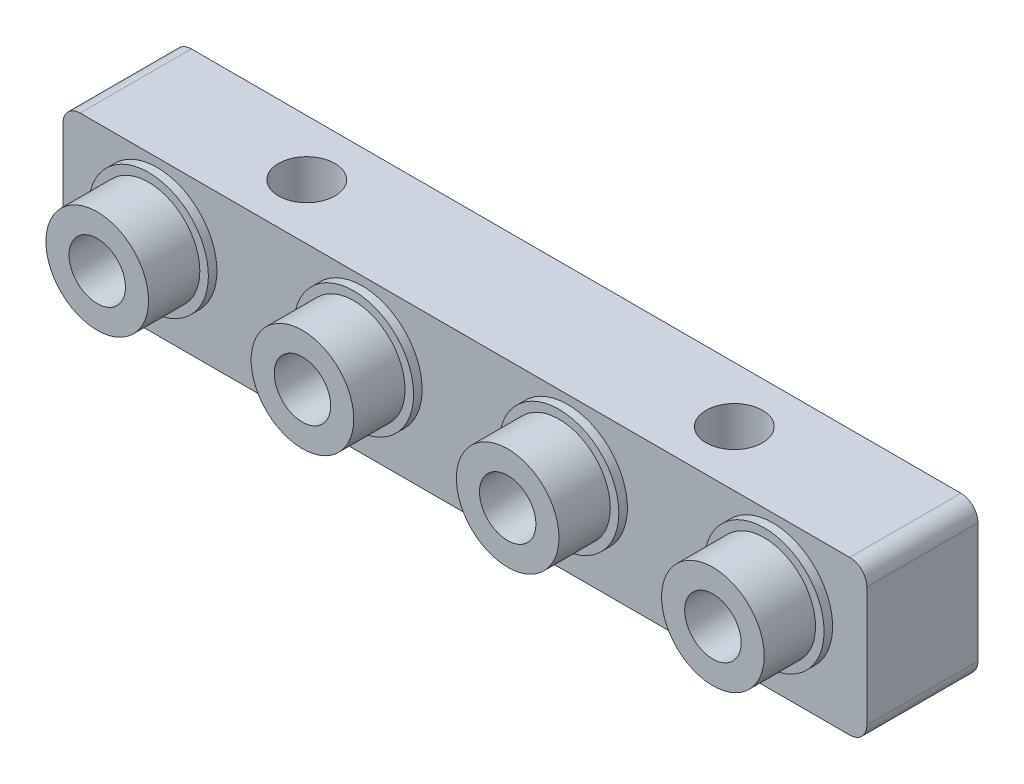
ISO-10303-21;
HEADER;
FILE_DESCRIPTION(('STEP AP214'),'2;1');
FILE_NAME('part.step','',(''),(''),'','','');
FILE_SCHEMA(('AUTOMOTIVE_DESIGN { 1 0 10303 214 1 1 1 1 }'));
ENDSEC;
DATA;
#1=APPLICATION_CONTEXT('core data for automotive mechanical design processes');
#2=APPLICATION_PROTOCOL_DEFINITION('international standard','automotive_design',2000,#1);
#3=PRODUCT_CONTEXT('',#1,'mechanical');
#4=PRODUCT('Part','Part','',(#3));
#5=PRODUCT_RELATED_PRODUCT_CATEGORY('part','',(#4));
#6=PRODUCT_DEFINITION_FORMATION('','',#4);
#7=PRODUCT_DEFINITION_CONTEXT('part definition',#1,'design');
#8=PRODUCT_DEFINITION('design','',#6,#7);
#9=PRODUCT_DEFINITION_SHAPE('','',#8);
#10=(LENGTH_UNIT() NAMED_UNIT(*) SI_UNIT(.MILLI.,.METRE.));
#11=(NAMED_UNIT(*) PLANE_ANGLE_UNIT() SI_UNIT($,.RADIAN.));
#12=(NAMED_UNIT(*) SI_UNIT($,.STERADIAN.) SOLID_ANGLE_UNIT());
#13=UNCERTAINTY_MEASURE_WITH_UNIT(LENGTH_MEASURE(1.E-05),#10,'distance_accuracy_value','');
#14=(GEOMETRIC_REPRESENTATION_CONTEXT(3) GLOBAL_UNCERTAINTY_ASSIGNED_CONTEXT((#13)) GLOBAL_UNIT_ASSIGNED_CONTEXT((#10,
#11,#12)) REPRESENTATION_CONTEXT('',''));
#15=CARTESIAN_POINT('',(0.,0.,0.));
#16=DIRECTION('',(0.,0.,1.));
#17=DIRECTION('',(1.,0.,0.));
#18=AXIS2_PLACEMENT_3D('',#15,#16,#17);
#19=CARTESIAN_POINT('',(0.,0.,6.5));
#20=DIRECTION('',(1.,0.,0.));
#21=DIRECTION('',(0.,0.,-1.));
#22=AXIS2_PLACEMENT_3D('',#19,#20,#21);
#23=PLANE('',#22);
#24=DIRECTION('',(0.,-1.,0.));
#25=VECTOR('',#24,1.);
#26=CARTESIAN_POINT('',(0.,0.,0.));
#27=LINE('',#26,#25);
#28=CARTESIAN_POINT('',(0.,8.,0.));
#29=VERTEX_POINT('',#28);
#30=CARTESIAN_POINT('',(0.,1.,0.));
#31=VERTEX_POINT('',#30);
#32=EDGE_CURVE('E131',#29,#31,#27,.T.);
#33=ORIENTED_EDGE('',*,*,#32,.T.);
#34=DIRECTION('',(0.,0.,-1.));
#35=VECTOR('',#34,1.);
#36=CARTESIAN_POINT('',(0.,1.,6.5));
#37=LINE('',#36,#35);
#38=CARTESIAN_POINT('',(0.,1.,6.5));
#39=VERTEX_POINT('',#38);
#40=EDGE_CURVE('E11',#31,#39,#37,.F.);
#41=ORIENTED_EDGE('',*,*,#40,.T.);
#42=DIRECTION('',(0.,-1.,0.));
#43=VECTOR('',#42,1.);
#44=CARTESIAN_POINT('',(0.,0.,6.5));
#45=LINE('',#44,#43);
#46=CARTESIAN_POINT('',(0.,8.,6.5));
#47=VERTEX_POINT('',#46);
#48=EDGE_CURVE('E129',#47,#39,#45,.T.);
#49=ORIENTED_EDGE('',*,*,#48,.F.);
#50=DIRECTION('',(0.,0.,-1.));
#51=VECTOR('',#50,1.);
#52=CARTESIAN_POINT('',(0.,8.,6.5));
#53=LINE('',#52,#51);
#54=EDGE_CURVE('E43',#47,#29,#53,.T.);
#55=ORIENTED_EDGE('',*,*,#54,.T.);
#56=EDGE_LOOP('',(#33,#41,#49,#55));
#57=FACE_BOUND('',#56,.T.);
#58=ADVANCED_FACE('F35',(#57),#23,.F.);
#59=CARTESIAN_POINT('',(0.,0.,6.5));
#60=DIRECTION('',(0.,1.,0.));
#61=DIRECTION('',(0.,0.,1.));
#62=AXIS2_PLACEMENT_3D('',#59,#60,#61);
#63=PLANE('',#62);
#64=CARTESIAN_POINT('',(11.,0.,3.25));
#65=DIRECTION('',(0.,1.,0.));
#66=DIRECTION('',(0.,0.,1.));
#67=AXIS2_PLACEMENT_3D('',#64,#65,#66);
#68=CIRCLE('',#67,1.65);
#69=CARTESIAN_POINT('',(11.,0.,4.9));
#70=VERTEX_POINT('',#69);
#71=EDGE_CURVE('E227',#70,#70,#68,.F.);
#72=ORIENTED_EDGE('',*,*,#71,.F.);
#73=EDGE_LOOP('',(#72));
#74=FACE_BOUND('',#73,.T.);
#75=CARTESIAN_POINT('',(36.,0.,3.25));
#76=DIRECTION('',(0.,1.,0.));
#77=DIRECTION('',(0.,0.,1.));
#78=AXIS2_PLACEMENT_3D('',#75,#76,#77);
#79=CIRCLE('',#78,1.65);
#80=CARTESIAN_POINT('',(36.,0.,4.9));
#81=VERTEX_POINT('',#80);
#82=EDGE_CURVE('E244',#81,#81,#79,.F.);
#83=ORIENTED_EDGE('',*,*,#82,.F.);
#84=EDGE_LOOP('',(#83));
#85=FACE_BOUND('',#84,.T.);
#86=DIRECTION('',(1.,0.,0.));
#87=VECTOR('',#86,1.);
#88=CARTESIAN_POINT('',(0.,0.,0.));
#89=LINE('',#88,#87);
#90=CARTESIAN_POINT('',(1.,0.,0.));
#91=VERTEX_POINT('',#90);
#92=CARTESIAN_POINT('',(46.,0.,0.));
#93=VERTEX_POINT('',#92);
#94=EDGE_CURVE('E127',#91,#93,#89,.T.);
#95=ORIENTED_EDGE('',*,*,#94,.T.);
#96=DIRECTION('',(0.,0.,-1.));
#97=VECTOR('',#96,1.);
#98=CARTESIAN_POINT('',(46.,0.,6.5));
#99=LINE('',#98,#97);
#100=CARTESIAN_POINT('',(46.,0.,6.5));
#101=VERTEX_POINT('',#100);
#102=EDGE_CURVE('E106',#93,#101,#99,.F.);
#103=ORIENTED_EDGE('',*,*,#102,.T.);
#104=DIRECTION('',(1.,0.,0.));
#105=VECTOR('',#104,1.);
#106=CARTESIAN_POINT('',(0.,0.,6.5));
#107=LINE('',#106,#105);
#108=CARTESIAN_POINT('',(1.,0.,6.5));
#109=VERTEX_POINT('',#108);
#110=EDGE_CURVE('E200',#109,#101,#107,.T.);
#111=ORIENTED_EDGE('',*,*,#110,.F.);
#112=DIRECTION('',(0.,0.,-1.));
#113=VECTOR('',#112,1.);
#114=CARTESIAN_POINT('',(1.,0.,6.5));
#115=LINE('',#114,#113);
#116=EDGE_CURVE('E111',#109,#91,#115,.T.);
#117=ORIENTED_EDGE('',*,*,#116,.T.);
#118=EDGE_LOOP('',(#95,#103,#111,#117));
#119=FACE_BOUND('',#118,.T.);
#120=ADVANCED_FACE('F271',(#74,#85,#119),#63,.F.);
#121=CARTESIAN_POINT('',(47.,0.,6.5));
#122=DIRECTION('',(-1.,0.,0.));
#123=DIRECTION('',(0.,0.,1.));
#124=AXIS2_PLACEMENT_3D('',#121,#122,#123);
#125=PLANE('',#124);
#126=DIRECTION('',(0.,1.,0.));
#127=VECTOR('',#126,1.);
#128=CARTESIAN_POINT('',(47.,0.,6.5));
#129=LINE('',#128,#127);
#130=CARTESIAN_POINT('',(47.,1.,6.5));
#131=VERTEX_POINT('',#130);
#132=CARTESIAN_POINT('',(47.,8.,6.5));
#133=VERTEX_POINT('',#132);
#134=EDGE_CURVE('E120',#131,#133,#129,.T.);
#135=ORIENTED_EDGE('',*,*,#134,.F.);
#136=DIRECTION('',(0.,0.,-1.));
#137=VECTOR('',#136,1.);
#138=CARTESIAN_POINT('',(47.,1.,6.5));
#139=LINE('',#138,#137);
#140=CARTESIAN_POINT('',(47.,1.,0.));
#141=VERTEX_POINT('',#140);
#142=EDGE_CURVE('E105',#131,#141,#139,.T.);
#143=ORIENTED_EDGE('',*,*,#142,.T.);
#144=DIRECTION('',(0.,1.,0.));
#145=VECTOR('',#144,1.);
#146=CARTESIAN_POINT('',(47.,0.,0.));
#147=LINE('',#146,#145);
#148=CARTESIAN_POINT('',(47.,8.,0.));
#149=VERTEX_POINT('',#148);
#150=EDGE_CURVE('E118',#141,#149,#147,.T.);
#151=ORIENTED_EDGE('',*,*,#150,.T.);
#152=DIRECTION('',(0.,0.,-1.));
#153=VECTOR('',#152,1.);
#154=CARTESIAN_POINT('',(47.,8.,6.5));
#155=LINE('',#154,#153);
#156=EDGE_CURVE('E122',#149,#133,#155,.F.);
#157=ORIENTED_EDGE('',*,*,#156,.T.);
#158=EDGE_LOOP('',(#135,#143,#151,#157));
#159=FACE_BOUND('',#158,.T.);
#160=ADVANCED_FACE('F117',(#159),#125,.F.);
#161=CARTESIAN_POINT('',(0.,9.,6.5));
#162=DIRECTION('',(0.,-1.,0.));
#163=DIRECTION('',(0.,0.,-1.));
#164=AXIS2_PLACEMENT_3D('',#161,#162,#163);
#165=PLANE('',#164);
#166=CARTESIAN_POINT('',(11.,9.,3.25));
#167=DIRECTION('',(0.,1.,0.));
#168=DIRECTION('',(0.,0.,1.));
#169=AXIS2_PLACEMENT_3D('',#166,#167,#168);
#170=CIRCLE('',#169,1.65);
#171=CARTESIAN_POINT('',(11.,9.,4.9));
#172=VERTEX_POINT('',#171);
#173=EDGE_CURVE('E247',#172,#172,#170,.T.);
#174=ORIENTED_EDGE('',*,*,#173,.F.);
#175=EDGE_LOOP('',(#174));
#176=FACE_BOUND('',#175,.T.);
#177=CARTESIAN_POINT('',(36.,9.,3.25));
#178=DIRECTION('',(0.,1.,0.));
#179=DIRECTION('',(0.,0.,-1.));
#180=AXIS2_PLACEMENT_3D('',#177,#178,#179);
#181=CIRCLE('',#180,1.65);
#182=CARTESIAN_POINT('',(36.,9.,1.59999999999999));
#183=VERTEX_POINT('',#182);
#184=EDGE_CURVE('E248',#183,#183,#181,.T.);
#185=ORIENTED_EDGE('',*,*,#184,.F.);
#186=EDGE_LOOP('',(#185));
#187=FACE_BOUND('',#186,.T.);
#188=DIRECTION('',(-1.,0.,0.));
#189=VECTOR('',#188,1.);
#190=CARTESIAN_POINT('',(0.,9.,6.5));
#191=LINE('',#190,#189);
#192=CARTESIAN_POINT('',(46.,9.,6.5));
#193=VERTEX_POINT('',#192);
#194=CARTESIAN_POINT('',(1.,9.,6.5));
#195=VERTEX_POINT('',#194);
#196=EDGE_CURVE('E144',#193,#195,#191,.T.);
#197=ORIENTED_EDGE('',*,*,#196,.F.);
#198=DIRECTION('',(0.,0.,-1.));
#199=VECTOR('',#198,1.);
#200=CARTESIAN_POINT('',(46.,9.,6.5));
#201=LINE('',#200,#199);
#202=CARTESIAN_POINT('',(46.,9.,0.));
#203=VERTEX_POINT('',#202);
#204=EDGE_CURVE('E181',#193,#203,#201,.T.);
#205=ORIENTED_EDGE('',*,*,#204,.T.);
#206=DIRECTION('',(-1.,0.,0.));
#207=VECTOR('',#206,1.);
#208=CARTESIAN_POINT('',(0.,9.,0.));
#209=LINE('',#208,#207);
#210=CARTESIAN_POINT('',(1.,9.,0.));
#211=VERTEX_POINT('',#210);
#212=EDGE_CURVE('E126',#203,#211,#209,.T.);
#213=ORIENTED_EDGE('',*,*,#212,.T.);
#214=DIRECTION('',(0.,0.,-1.));
#215=VECTOR('',#214,1.);
#216=CARTESIAN_POINT('',(1.,9.,6.5));
#217=LINE('',#216,#215);
#218=EDGE_CURVE('E50',#211,#195,#217,.F.);
#219=ORIENTED_EDGE('',*,*,#218,.T.);
#220=EDGE_LOOP('',(#197,#205,#213,#219));
#221=FACE_BOUND('',#220,.T.);
#222=ADVANCED_FACE('F258',(#176,#187,#221),#165,.F.);
#223=CARTESIAN_POINT('',(0.,0.,6.5));
#224=DIRECTION('',(0.,0.,-1.));
#225=DIRECTION('',(-1.,0.,0.));
#226=AXIS2_PLACEMENT_3D('',#223,#224,#225);
#227=PLANE('',#226);
#228=CARTESIAN_POINT('',(41.5,5.,6.5));
#229=DIRECTION('',(0.,0.,-1.));
#230=DIRECTION('',(-1.,0.,0.));
#231=AXIS2_PLACEMENT_3D('',#228,#229,#230);
#232=CIRCLE('',#231,3.5);
#233=CARTESIAN_POINT('',(38.,5.,6.5));
#234=VERTEX_POINT('',#233);
#235=EDGE_CURVE('E158',#234,#234,#232,.F.);
#236=ORIENTED_EDGE('',*,*,#235,.F.);
#237=EDGE_LOOP('',(#236));
#238=FACE_BOUND('',#237,.T.);
#239=CARTESIAN_POINT('',(29.5,5.,6.5));
#240=DIRECTION('',(0.,0.,-1.));
#241=DIRECTION('',(-1.,0.,0.));
#242=AXIS2_PLACEMENT_3D('',#239,#240,#241);
#243=CIRCLE('',#242,3.49999999999999);
#244=CARTESIAN_POINT('',(26.,5.,6.5));
#245=VERTEX_POINT('',#244);
#246=EDGE_CURVE('E151',#245,#245,#243,.F.);
#247=ORIENTED_EDGE('',*,*,#246,.F.);
#248=EDGE_LOOP('',(#247));
#249=FACE_BOUND('',#248,.T.);
#250=CARTESIAN_POINT('',(17.5,5.,6.5));
#251=DIRECTION('',(0.,0.,-1.));
#252=DIRECTION('',(-1.,0.,0.));
#253=AXIS2_PLACEMENT_3D('',#250,#251,#252);
#254=CIRCLE('',#253,3.5);
#255=CARTESIAN_POINT('',(14.,5.,6.5));
#256=VERTEX_POINT('',#255);
#257=EDGE_CURVE('E143',#256,#256,#254,.F.);
#258=ORIENTED_EDGE('',*,*,#257,.F.);
#259=EDGE_LOOP('',(#258));
#260=FACE_BOUND('',#259,.T.);
#261=CARTESIAN_POINT('',(5.5,5.,6.5));
#262=DIRECTION('',(0.,0.,-1.));
#263=DIRECTION('',(-1.,0.,0.));
#264=AXIS2_PLACEMENT_3D('',#261,#262,#263);
#265=CIRCLE('',#264,3.5);
#266=CARTESIAN_POINT('',(2.,5.,6.5));
#267=VERTEX_POINT('',#266);
#268=EDGE_CURVE('E140',#267,#267,#265,.F.);
#269=ORIENTED_EDGE('',*,*,#268,.F.);
#270=EDGE_LOOP('',(#269));
#271=FACE_BOUND('',#270,.T.);
#272=ORIENTED_EDGE('',*,*,#110,.T.);
#273=CARTESIAN_POINT('',(46.,1.,6.5));
#274=DIRECTION('',(0.,0.,-1.));
#275=DIRECTION('',(-1.,0.,0.));
#276=AXIS2_PLACEMENT_3D('',#273,#274,#275);
#277=CIRCLE('',#276,1.);
#278=EDGE_CURVE('E178',#101,#131,#277,.F.);
#279=ORIENTED_EDGE('',*,*,#278,.T.);
#280=ORIENTED_EDGE('',*,*,#134,.T.);
#281=CARTESIAN_POINT('',(46.,8.,6.5));
#282=DIRECTION('',(0.,0.,-1.));
#283=DIRECTION('',(-1.,0.,0.));
#284=AXIS2_PLACEMENT_3D('',#281,#282,#283);
#285=CIRCLE('',#284,1.);
#286=EDGE_CURVE('E57',#133,#193,#285,.F.);
#287=ORIENTED_EDGE('',*,*,#286,.T.);
#288=ORIENTED_EDGE('',*,*,#196,.T.);
#289=CARTESIAN_POINT('',(1.,8.,6.5));
#290=DIRECTION('',(0.,0.,-1.));
#291=DIRECTION('',(-1.,0.,0.));
#292=AXIS2_PLACEMENT_3D('',#289,#290,#291);
#293=CIRCLE('',#292,1.);
#294=EDGE_CURVE('E173',#195,#47,#293,.F.);
#295=ORIENTED_EDGE('',*,*,#294,.T.);
#296=ORIENTED_EDGE('',*,*,#48,.T.);
#297=CARTESIAN_POINT('',(1.,1.,6.5));
#298=DIRECTION('',(0.,0.,-1.));
#299=DIRECTION('',(-1.,0.,0.));
#300=AXIS2_PLACEMENT_3D('',#297,#298,#299);
#301=CIRCLE('',#300,1.);
#302=EDGE_CURVE('E175',#39,#109,#301,.F.);
#303=ORIENTED_EDGE('',*,*,#302,.T.);
#304=EDGE_LOOP('',(#272,#279,#280,#287,#288,#295,#296,#303));
#305=FACE_BOUND('',#304,.T.);
#306=ADVANCED_FACE('F261',(#238,#249,#260,#271,#305),#227,.F.);
#307=CARTESIAN_POINT('',(0.,0.,0.));
#308=DIRECTION('',(0.,0.,-1.));
#309=DIRECTION('',(-1.,0.,0.));
#310=AXIS2_PLACEMENT_3D('',#307,#308,#309);
#311=PLANE('',#310);
#312=CARTESIAN_POINT('',(5.5,5.,0.));
#313=DIRECTION('',(0.,0.,-1.));
#314=DIRECTION('',(-1.,0.,0.));
#315=AXIS2_PLACEMENT_3D('',#312,#313,#314);
#316=CIRCLE('',#315,1.65);
#317=CARTESIAN_POINT('',(3.85,5.,0.));
#318=VERTEX_POINT('',#317);
#319=EDGE_CURVE('E219',#318,#318,#316,.F.);
#320=ORIENTED_EDGE('',*,*,#319,.T.);
#321=EDGE_LOOP('',(#320));
#322=FACE_BOUND('',#321,.T.);
#323=CARTESIAN_POINT('',(17.5,5.,0.));
#324=DIRECTION('',(0.,0.,-1.));
#325=DIRECTION('',(-1.,0.,0.));
#326=AXIS2_PLACEMENT_3D('',#323,#324,#325);
#327=CIRCLE('',#326,1.65);
#328=CARTESIAN_POINT('',(15.85,5.,0.));
#329=VERTEX_POINT('',#328);
#330=EDGE_CURVE('E234',#329,#329,#327,.F.);
#331=ORIENTED_EDGE('',*,*,#330,.T.);
#332=EDGE_LOOP('',(#331));
#333=FACE_BOUND('',#332,.T.);
#334=CARTESIAN_POINT('',(29.5,5.,0.));
#335=DIRECTION('',(0.,0.,-1.));
#336=DIRECTION('',(-1.,0.,0.));
#337=AXIS2_PLACEMENT_3D('',#334,#335,#336);
#338=CIRCLE('',#337,1.65);
#339=CARTESIAN_POINT('',(27.85,5.,0.));
#340=VERTEX_POINT('',#339);
#341=EDGE_CURVE('E228',#340,#340,#338,.F.);
#342=ORIENTED_EDGE('',*,*,#341,.T.);
#343=EDGE_LOOP('',(#342));
#344=FACE_BOUND('',#343,.T.);
#345=CARTESIAN_POINT('',(41.5,5.,0.));
#346=DIRECTION('',(0.,0.,-1.));
#347=DIRECTION('',(-1.,0.,0.));
#348=AXIS2_PLACEMENT_3D('',#345,#346,#347);
#349=CIRCLE('',#348,1.65);
#350=CARTESIAN_POINT('',(39.85,5.,0.));
#351=VERTEX_POINT('',#350);
#352=EDGE_CURVE('E220',#351,#351,#349,.F.);
#353=ORIENTED_EDGE('',*,*,#352,.T.);
#354=EDGE_LOOP('',(#353));
#355=FACE_BOUND('',#354,.T.);
#356=ORIENTED_EDGE('',*,*,#150,.F.);
#357=CARTESIAN_POINT('',(46.,1.,0.));
#358=DIRECTION('',(0.,0.,-1.));
#359=DIRECTION('',(-1.,0.,0.));
#360=AXIS2_PLACEMENT_3D('',#357,#358,#359);
#361=CIRCLE('',#360,1.);
#362=EDGE_CURVE('E101',#141,#93,#361,.T.);
#363=ORIENTED_EDGE('',*,*,#362,.T.);
#364=ORIENTED_EDGE('',*,*,#94,.F.);
#365=CARTESIAN_POINT('',(1.,1.,0.));
#366=DIRECTION('',(0.,0.,-1.));
#367=DIRECTION('',(-1.,0.,0.));
#368=AXIS2_PLACEMENT_3D('',#365,#366,#367);
#369=CIRCLE('',#368,1.);
#370=EDGE_CURVE('E167',#91,#31,#369,.T.);
#371=ORIENTED_EDGE('',*,*,#370,.T.);
#372=ORIENTED_EDGE('',*,*,#32,.F.);
#373=CARTESIAN_POINT('',(1.,8.,0.));
#374=DIRECTION('',(0.,0.,-1.));
#375=DIRECTION('',(-1.,0.,0.));
#376=AXIS2_PLACEMENT_3D('',#373,#374,#375);
#377=CIRCLE('',#376,1.);
#378=EDGE_CURVE('E121',#29,#211,#377,.T.);
#379=ORIENTED_EDGE('',*,*,#378,.T.);
#380=ORIENTED_EDGE('',*,*,#212,.F.);
#381=CARTESIAN_POINT('',(46.,8.,0.));
#382=DIRECTION('',(0.,0.,-1.));
#383=DIRECTION('',(-1.,0.,0.));
#384=AXIS2_PLACEMENT_3D('',#381,#382,#383);
#385=CIRCLE('',#384,1.);
#386=EDGE_CURVE('E112',#203,#149,#385,.T.);
#387=ORIENTED_EDGE('',*,*,#386,.T.);
#388=EDGE_LOOP('',(#356,#363,#364,#371,#372,#379,#380,#387));
#389=FACE_BOUND('',#388,.T.);
#390=ADVANCED_FACE('F124',(#322,#333,#344,#355,#389),#311,.T.);
#391=CARTESIAN_POINT('',(5.5,5.,7.));
#392=DIRECTION('',(0.,0.,-1.));
#393=DIRECTION('',(-1.,0.,0.));
#394=AXIS2_PLACEMENT_3D('',#391,#392,#393);
#395=CYLINDRICAL_SURFACE('',#394,3.5);
#396=CARTESIAN_POINT('',(5.5,5.,7.));
#397=DIRECTION('',(0.,0.,1.));
#398=DIRECTION('',(1.,0.,0.));
#399=AXIS2_PLACEMENT_3D('',#396,#397,#398);
#400=CIRCLE('',#399,3.5);
#401=CARTESIAN_POINT('',(9.,5.,7.));
#402=VERTEX_POINT('',#401);
#403=EDGE_CURVE('E139',#402,#402,#400,.T.);
#404=ORIENTED_EDGE('',*,*,#403,.F.);
#405=EDGE_LOOP('',(#404));
#406=FACE_BOUND('',#405,.T.);
#407=ORIENTED_EDGE('',*,*,#268,.T.);
#408=EDGE_LOOP('',(#407));
#409=FACE_BOUND('',#408,.T.);
#410=ADVANCED_FACE('F440',(#406,#409),#395,.T.);
#411=CARTESIAN_POINT('',(5.5,5.,7.));
#412=DIRECTION('',(0.,0.,1.));
#413=DIRECTION('',(1.,0.,0.));
#414=AXIS2_PLACEMENT_3D('',#411,#412,#413);
#415=PLANE('',#414);
#416=CARTESIAN_POINT('',(5.5,5.,7.));
#417=DIRECTION('',(0.,0.,1.));
#418=DIRECTION('',(1.,0.,0.));
#419=AXIS2_PLACEMENT_3D('',#416,#417,#418);
#420=CIRCLE('',#419,3.);
#421=CARTESIAN_POINT('',(8.5,5.,7.));
#422=VERTEX_POINT('',#421);
#423=EDGE_CURVE('E135',#422,#422,#420,.T.);
#424=ORIENTED_EDGE('',*,*,#423,.F.);
#425=EDGE_LOOP('',(#424));
#426=FACE_BOUND('',#425,.T.);
#427=ORIENTED_EDGE('',*,*,#403,.T.);
#428=EDGE_LOOP('',(#427));
#429=FACE_BOUND('',#428,.T.);
#430=ADVANCED_FACE('F433',(#426,#429),#415,.T.);
#431=CARTESIAN_POINT('',(5.5,5.,10.));
#432=DIRECTION('',(0.,0.,1.));
#433=DIRECTION('',(1.,0.,0.));
#434=AXIS2_PLACEMENT_3D('',#431,#432,#433);
#435=PLANE('',#434);
#436=CARTESIAN_POINT('',(5.5,5.,10.));
#437=DIRECTION('',(0.,0.,1.));
#438=DIRECTION('',(1.,0.,0.));
#439=AXIS2_PLACEMENT_3D('',#436,#437,#438);
#440=CIRCLE('',#439,1.65);
#441=CARTESIAN_POINT('',(7.15,5.,10.));
#442=VERTEX_POINT('',#441);
#443=EDGE_CURVE('E237',#442,#442,#440,.T.);
#444=ORIENTED_EDGE('',*,*,#443,.F.);
#445=EDGE_LOOP('',(#444));
#446=FACE_BOUND('',#445,.T.);
#447=CARTESIAN_POINT('',(5.5,5.,10.));
#448=DIRECTION('',(0.,0.,1.));
#449=DIRECTION('',(1.,0.,0.));
#450=AXIS2_PLACEMENT_3D('',#447,#448,#449);
#451=CIRCLE('',#450,3.);
#452=CARTESIAN_POINT('',(8.5,5.,10.));
#453=VERTEX_POINT('',#452);
#454=EDGE_CURVE('E193',#453,#453,#451,.T.);
#455=ORIENTED_EDGE('',*,*,#454,.T.);
#456=EDGE_LOOP('',(#455));
#457=FACE_BOUND('',#456,.T.);
#458=ADVANCED_FACE('F439',(#446,#457),#435,.T.);
#459=CARTESIAN_POINT('',(5.5,5.,10.));
#460=DIRECTION('',(0.,0.,-1.));
#461=DIRECTION('',(-1.,0.,0.));
#462=AXIS2_PLACEMENT_3D('',#459,#460,#461);
#463=CYLINDRICAL_SURFACE('',#462,3.);
#464=ORIENTED_EDGE('',*,*,#423,.T.);
#465=EDGE_LOOP('',(#464));
#466=FACE_BOUND('',#465,.T.);
#467=ORIENTED_EDGE('',*,*,#454,.F.);
#468=EDGE_LOOP('',(#467));
#469=FACE_BOUND('',#468,.T.);
#470=ADVANCED_FACE('F428',(#466,#469),#463,.T.);
#471=CARTESIAN_POINT('',(17.5,5.,7.));
#472=DIRECTION('',(0.,0.,-1.));
#473=DIRECTION('',(-1.,0.,0.));
#474=AXIS2_PLACEMENT_3D('',#471,#472,#473);
#475=CYLINDRICAL_SURFACE('',#474,3.5);
#476=CARTESIAN_POINT('',(17.5,5.,7.));
#477=DIRECTION('',(0.,0.,1.));
#478=DIRECTION('',(1.,0.,0.));
#479=AXIS2_PLACEMENT_3D('',#476,#477,#478);
#480=CIRCLE('',#479,3.5);
#481=CARTESIAN_POINT('',(21.,5.,7.));
#482=VERTEX_POINT('',#481);
#483=EDGE_CURVE('E148',#482,#482,#480,.T.);
#484=ORIENTED_EDGE('',*,*,#483,.F.);
#485=EDGE_LOOP('',(#484));
#486=FACE_BOUND('',#485,.T.);
#487=ORIENTED_EDGE('',*,*,#257,.T.);
#488=EDGE_LOOP('',(#487));
#489=FACE_BOUND('',#488,.T.);
#490=ADVANCED_FACE('F419',(#486,#489),#475,.T.);
#491=CARTESIAN_POINT('',(17.5,5.,7.));
#492=DIRECTION('',(0.,0.,1.));
#493=DIRECTION('',(1.,0.,0.));
#494=AXIS2_PLACEMENT_3D('',#491,#492,#493);
#495=PLANE('',#494);
#496=CARTESIAN_POINT('',(17.5,5.,7.));
#497=DIRECTION('',(0.,0.,1.));
#498=DIRECTION('',(1.,0.,0.));
#499=AXIS2_PLACEMENT_3D('',#496,#497,#498);
#500=CIRCLE('',#499,3.);
#501=CARTESIAN_POINT('',(20.5,5.,7.));
#502=VERTEX_POINT('',#501);
#503=EDGE_CURVE('E145',#502,#502,#500,.T.);
#504=ORIENTED_EDGE('',*,*,#503,.F.);
#505=EDGE_LOOP('',(#504));
#506=FACE_BOUND('',#505,.T.);
#507=ORIENTED_EDGE('',*,*,#483,.T.);
#508=EDGE_LOOP('',(#507));
#509=FACE_BOUND('',#508,.T.);
#510=ADVANCED_FACE('F412',(#506,#509),#495,.T.);
#511=CARTESIAN_POINT('',(17.5,5.,10.));
#512=DIRECTION('',(0.,0.,1.));
#513=DIRECTION('',(1.,0.,0.));
#514=AXIS2_PLACEMENT_3D('',#511,#512,#513);
#515=PLANE('',#514);
#516=CARTESIAN_POINT('',(17.5,5.,10.));
#517=DIRECTION('',(0.,0.,1.));
#518=DIRECTION('',(1.,0.,0.));
#519=AXIS2_PLACEMENT_3D('',#516,#517,#518);
#520=CIRCLE('',#519,1.65);
#521=CARTESIAN_POINT('',(19.15,5.,10.));
#522=VERTEX_POINT('',#521);
#523=EDGE_CURVE('E231',#522,#522,#520,.T.);
#524=ORIENTED_EDGE('',*,*,#523,.F.);
#525=EDGE_LOOP('',(#524));
#526=FACE_BOUND('',#525,.T.);
#527=CARTESIAN_POINT('',(17.5,5.,10.));
#528=DIRECTION('',(0.,0.,1.));
#529=DIRECTION('',(1.,0.,0.));
#530=AXIS2_PLACEMENT_3D('',#527,#528,#529);
#531=CIRCLE('',#530,3.);
#532=CARTESIAN_POINT('',(20.5,5.,10.));
#533=VERTEX_POINT('',#532);
#534=EDGE_CURVE('E195',#533,#533,#531,.T.);
#535=ORIENTED_EDGE('',*,*,#534,.T.);
#536=EDGE_LOOP('',(#535));
#537=FACE_BOUND('',#536,.T.);
#538=ADVANCED_FACE('F418',(#526,#537),#515,.T.);
#539=CARTESIAN_POINT('',(17.5,5.,10.));
#540=DIRECTION('',(0.,0.,-1.));
#541=DIRECTION('',(-1.,0.,0.));
#542=AXIS2_PLACEMENT_3D('',#539,#540,#541);
#543=CYLINDRICAL_SURFACE('',#542,3.);
#544=ORIENTED_EDGE('',*,*,#503,.T.);
#545=EDGE_LOOP('',(#544));
#546=FACE_BOUND('',#545,.T.);
#547=ORIENTED_EDGE('',*,*,#534,.F.);
#548=EDGE_LOOP('',(#547));
#549=FACE_BOUND('',#548,.T.);
#550=ADVANCED_FACE('F407',(#546,#549),#543,.T.);
#551=CARTESIAN_POINT('',(29.5,5.,7.));
#552=DIRECTION('',(0.,0.,-1.));
#553=DIRECTION('',(-1.,0.,0.));
#554=AXIS2_PLACEMENT_3D('',#551,#552,#553);
#555=CYLINDRICAL_SURFACE('',#554,3.49999999999999);
#556=CARTESIAN_POINT('',(29.5,5.,7.));
#557=DIRECTION('',(0.,0.,1.));
#558=DIRECTION('',(1.,0.,0.));
#559=AXIS2_PLACEMENT_3D('',#556,#557,#558);
#560=CIRCLE('',#559,3.49999999999999);
#561=CARTESIAN_POINT('',(33.,5.,7.));
#562=VERTEX_POINT('',#561);
#563=EDGE_CURVE('E155',#562,#562,#560,.T.);
#564=ORIENTED_EDGE('',*,*,#563,.F.);
#565=EDGE_LOOP('',(#564));
#566=FACE_BOUND('',#565,.T.);
#567=ORIENTED_EDGE('',*,*,#246,.T.);
#568=EDGE_LOOP('',(#567));
#569=FACE_BOUND('',#568,.T.);
#570=ADVANCED_FACE('F398',(#566,#569),#555,.T.);
#571=CARTESIAN_POINT('',(29.5,5.,7.));
#572=DIRECTION('',(0.,0.,1.));
#573=DIRECTION('',(1.,0.,0.));
#574=AXIS2_PLACEMENT_3D('',#571,#572,#573);
#575=PLANE('',#574);
#576=CARTESIAN_POINT('',(29.5,5.,7.));
#577=DIRECTION('',(0.,0.,1.));
#578=DIRECTION('',(1.,0.,0.));
#579=AXIS2_PLACEMENT_3D('',#576,#577,#578);
#580=CIRCLE('',#579,3.);
#581=CARTESIAN_POINT('',(32.5,5.,7.));
#582=VERTEX_POINT('',#581);
#583=EDGE_CURVE('E152',#582,#582,#580,.T.);
#584=ORIENTED_EDGE('',*,*,#583,.F.);
#585=EDGE_LOOP('',(#584));
#586=FACE_BOUND('',#585,.T.);
#587=ORIENTED_EDGE('',*,*,#563,.T.);
#588=EDGE_LOOP('',(#587));
#589=FACE_BOUND('',#588,.T.);
#590=ADVANCED_FACE('F391',(#586,#589),#575,.T.);
#591=CARTESIAN_POINT('',(29.5,5.,10.));
#592=DIRECTION('',(0.,0.,1.));
#593=DIRECTION('',(1.,0.,0.));
#594=AXIS2_PLACEMENT_3D('',#591,#592,#593);
#595=PLANE('',#594);
#596=CARTESIAN_POINT('',(29.5,5.,10.));
#597=DIRECTION('',(0.,0.,1.));
#598=DIRECTION('',(1.,0.,0.));
#599=AXIS2_PLACEMENT_3D('',#596,#597,#598);
#600=CIRCLE('',#599,1.65);
#601=CARTESIAN_POINT('',(31.15,5.,10.));
#602=VERTEX_POINT('',#601);
#603=EDGE_CURVE('E223',#602,#602,#600,.T.);
#604=ORIENTED_EDGE('',*,*,#603,.F.);
#605=EDGE_LOOP('',(#604));
#606=FACE_BOUND('',#605,.T.);
#607=CARTESIAN_POINT('',(29.5,5.,10.));
#608=DIRECTION('',(0.,0.,1.));
#609=DIRECTION('',(1.,0.,0.));
#610=AXIS2_PLACEMENT_3D('',#607,#608,#609);
#611=CIRCLE('',#610,3.);
#612=CARTESIAN_POINT('',(32.5,5.,10.));
#613=VERTEX_POINT('',#612);
#614=EDGE_CURVE('E206',#613,#613,#611,.T.);
#615=ORIENTED_EDGE('',*,*,#614,.T.);
#616=EDGE_LOOP('',(#615));
#617=FACE_BOUND('',#616,.T.);
#618=ADVANCED_FACE('F397',(#606,#617),#595,.T.);
#619=CARTESIAN_POINT('',(29.5,5.,10.));
#620=DIRECTION('',(0.,0.,-1.));
#621=DIRECTION('',(-1.,0.,0.));
#622=AXIS2_PLACEMENT_3D('',#619,#620,#621);
#623=CYLINDRICAL_SURFACE('',#622,3.);
#624=ORIENTED_EDGE('',*,*,#583,.T.);
#625=EDGE_LOOP('',(#624));
#626=FACE_BOUND('',#625,.T.);
#627=ORIENTED_EDGE('',*,*,#614,.F.);
#628=EDGE_LOOP('',(#627));
#629=FACE_BOUND('',#628,.T.);
#630=ADVANCED_FACE('F386',(#626,#629),#623,.T.);
#631=CARTESIAN_POINT('',(41.5,5.,7.));
#632=DIRECTION('',(0.,0.,-1.));
#633=DIRECTION('',(-1.,0.,0.));
#634=AXIS2_PLACEMENT_3D('',#631,#632,#633);
#635=CYLINDRICAL_SURFACE('',#634,3.5);
#636=CARTESIAN_POINT('',(41.5,5.,7.));
#637=DIRECTION('',(0.,0.,1.));
#638=DIRECTION('',(1.,0.,0.));
#639=AXIS2_PLACEMENT_3D('',#636,#637,#638);
#640=CIRCLE('',#639,3.5);
#641=CARTESIAN_POINT('',(45.,5.,7.));
#642=VERTEX_POINT('',#641);
#643=EDGE_CURVE('E162',#642,#642,#640,.T.);
#644=ORIENTED_EDGE('',*,*,#643,.F.);
#645=EDGE_LOOP('',(#644));
#646=FACE_BOUND('',#645,.T.);
#647=ORIENTED_EDGE('',*,*,#235,.T.);
#648=EDGE_LOOP('',(#647));
#649=FACE_BOUND('',#648,.T.);
#650=ADVANCED_FACE('F376',(#646,#649),#635,.T.);
#651=CARTESIAN_POINT('',(41.5,5.,7.));
#652=DIRECTION('',(0.,0.,1.));
#653=DIRECTION('',(1.,0.,0.));
#654=AXIS2_PLACEMENT_3D('',#651,#652,#653);
#655=PLANE('',#654);
#656=CARTESIAN_POINT('',(41.5,5.,7.));
#657=DIRECTION('',(0.,0.,1.));
#658=DIRECTION('',(1.,0.,0.));
#659=AXIS2_PLACEMENT_3D('',#656,#657,#658);
#660=CIRCLE('',#659,3.);
#661=CARTESIAN_POINT('',(44.5,5.,7.));
#662=VERTEX_POINT('',#661);
#663=EDGE_CURVE('E159',#662,#662,#660,.T.);
#664=ORIENTED_EDGE('',*,*,#663,.F.);
#665=EDGE_LOOP('',(#664));
#666=FACE_BOUND('',#665,.T.);
#667=ORIENTED_EDGE('',*,*,#643,.T.);
#668=EDGE_LOOP('',(#667));
#669=FACE_BOUND('',#668,.T.);
#670=ADVANCED_FACE('F369',(#666,#669),#655,.T.);
#671=CARTESIAN_POINT('',(41.5,5.,10.));
#672=DIRECTION('',(0.,0.,1.));
#673=DIRECTION('',(1.,0.,0.));
#674=AXIS2_PLACEMENT_3D('',#671,#672,#673);
#675=PLANE('',#674);
#676=CARTESIAN_POINT('',(41.5,5.,10.));
#677=DIRECTION('',(0.,0.,1.));
#678=DIRECTION('',(1.,0.,0.));
#679=AXIS2_PLACEMENT_3D('',#676,#677,#678);
#680=CIRCLE('',#679,1.65);
#681=CARTESIAN_POINT('',(43.15,5.,10.));
#682=VERTEX_POINT('',#681);
#683=EDGE_CURVE('E224',#682,#682,#680,.T.);
#684=ORIENTED_EDGE('',*,*,#683,.F.);
#685=EDGE_LOOP('',(#684));
#686=FACE_BOUND('',#685,.T.);
#687=CARTESIAN_POINT('',(41.5,5.,10.));
#688=DIRECTION('',(0.,0.,1.));
#689=DIRECTION('',(1.,0.,0.));
#690=AXIS2_PLACEMENT_3D('',#687,#688,#689);
#691=CIRCLE('',#690,3.);
#692=CARTESIAN_POINT('',(44.5,5.,10.));
#693=VERTEX_POINT('',#692);
#694=EDGE_CURVE('E138',#693,#693,#691,.T.);
#695=ORIENTED_EDGE('',*,*,#694,.T.);
#696=EDGE_LOOP('',(#695));
#697=FACE_BOUND('',#696,.T.);
#698=ADVANCED_FACE('F375',(#686,#697),#675,.T.);
#699=CARTESIAN_POINT('',(41.5,5.,10.));
#700=DIRECTION('',(0.,0.,-1.));
#701=DIRECTION('',(-1.,0.,0.));
#702=AXIS2_PLACEMENT_3D('',#699,#700,#701);
#703=CYLINDRICAL_SURFACE('',#702,3.);
#704=ORIENTED_EDGE('',*,*,#663,.T.);
#705=EDGE_LOOP('',(#704));
#706=FACE_BOUND('',#705,.T.);
#707=ORIENTED_EDGE('',*,*,#694,.F.);
#708=EDGE_LOOP('',(#707));
#709=FACE_BOUND('',#708,.T.);
#710=ADVANCED_FACE('F364',(#706,#709),#703,.T.);
#711=CARTESIAN_POINT('',(41.5,5.,-4.66690475583122));
#712=DIRECTION('',(0.,0.,1.));
#713=DIRECTION('',(1.,0.,0.));
#714=AXIS2_PLACEMENT_3D('',#711,#712,#713);
#715=CYLINDRICAL_SURFACE('',#714,1.65);
#716=ORIENTED_EDGE('',*,*,#683,.T.);
#717=EDGE_LOOP('',(#716));
#718=FACE_BOUND('',#717,.T.);
#719=ORIENTED_EDGE('',*,*,#352,.F.);
#720=EDGE_LOOP('',(#719));
#721=FACE_BOUND('',#720,.T.);
#722=ADVANCED_FACE('F355',(#718,#721),#715,.F.);
#723=CARTESIAN_POINT('',(29.5,5.,-4.66690475583122));
#724=DIRECTION('',(0.,0.,1.));
#725=DIRECTION('',(1.,0.,0.));
#726=AXIS2_PLACEMENT_3D('',#723,#724,#725);
#727=CYLINDRICAL_SURFACE('',#726,1.65);
#728=ORIENTED_EDGE('',*,*,#603,.T.);
#729=EDGE_LOOP('',(#728));
#730=FACE_BOUND('',#729,.T.);
#731=ORIENTED_EDGE('',*,*,#341,.F.);
#732=EDGE_LOOP('',(#731));
#733=FACE_BOUND('',#732,.T.);
#734=ADVANCED_FACE('F346',(#730,#733),#727,.F.);
#735=CARTESIAN_POINT('',(17.5,5.,-4.66690475583122));
#736=DIRECTION('',(0.,0.,1.));
#737=DIRECTION('',(1.,0.,0.));
#738=AXIS2_PLACEMENT_3D('',#735,#736,#737);
#739=CYLINDRICAL_SURFACE('',#738,1.65);
#740=ORIENTED_EDGE('',*,*,#523,.T.);
#741=EDGE_LOOP('',(#740));
#742=FACE_BOUND('',#741,.T.);
#743=ORIENTED_EDGE('',*,*,#330,.F.);
#744=EDGE_LOOP('',(#743));
#745=FACE_BOUND('',#744,.T.);
#746=ADVANCED_FACE('F337',(#742,#745),#739,.F.);
#747=CARTESIAN_POINT('',(5.5,5.,-4.66690475583122));
#748=DIRECTION('',(0.,0.,1.));
#749=DIRECTION('',(1.,0.,0.));
#750=AXIS2_PLACEMENT_3D('',#747,#748,#749);
#751=CYLINDRICAL_SURFACE('',#750,1.65);
#752=ORIENTED_EDGE('',*,*,#443,.T.);
#753=EDGE_LOOP('',(#752));
#754=FACE_BOUND('',#753,.T.);
#755=ORIENTED_EDGE('',*,*,#319,.F.);
#756=EDGE_LOOP('',(#755));
#757=FACE_BOUND('',#756,.T.);
#758=ADVANCED_FACE('F328',(#754,#757),#751,.F.);
#759=CARTESIAN_POINT('',(36.,-4.66690475583123,3.25));
#760=DIRECTION('',(0.,1.,0.));
#761=DIRECTION('',(0.,0.,1.));
#762=AXIS2_PLACEMENT_3D('',#759,#760,#761);
#763=CYLINDRICAL_SURFACE('',#762,1.65);
#764=ORIENTED_EDGE('',*,*,#82,.T.);
#765=EDGE_LOOP('',(#764));
#766=FACE_BOUND('',#765,.T.);
#767=ORIENTED_EDGE('',*,*,#184,.T.);
#768=EDGE_LOOP('',(#767));
#769=FACE_BOUND('',#768,.T.);
#770=ADVANCED_FACE('F319',(#766,#769),#763,.F.);
#771=CARTESIAN_POINT('',(11.,-4.66690475583123,3.25));
#772=DIRECTION('',(0.,1.,0.));
#773=DIRECTION('',(0.,0.,1.));
#774=AXIS2_PLACEMENT_3D('',#771,#772,#773);
#775=CYLINDRICAL_SURFACE('',#774,1.65);
#776=ORIENTED_EDGE('',*,*,#71,.T.);
#777=EDGE_LOOP('',(#776));
#778=FACE_BOUND('',#777,.T.);
#779=ORIENTED_EDGE('',*,*,#173,.T.);
#780=EDGE_LOOP('',(#779));
#781=FACE_BOUND('',#780,.T.);
#782=ADVANCED_FACE('F256',(#778,#781),#775,.F.);
#783=CARTESIAN_POINT('',(46.,1.,6.5));
#784=DIRECTION('',(0.,0.,-1.));
#785=DIRECTION('',(-1.,0.,0.));
#786=AXIS2_PLACEMENT_3D('',#783,#784,#785);
#787=CYLINDRICAL_SURFACE('',#786,1.);
#788=ORIENTED_EDGE('',*,*,#278,.F.);
#789=ORIENTED_EDGE('',*,*,#102,.F.);
#790=ORIENTED_EDGE('',*,*,#362,.F.);
#791=ORIENTED_EDGE('',*,*,#142,.F.);
#792=EDGE_LOOP('',(#788,#789,#790,#791));
#793=FACE_BOUND('',#792,.T.);
#794=ADVANCED_FACE('F104',(#793),#787,.T.);
#795=CARTESIAN_POINT('',(46.,8.,6.5));
#796=DIRECTION('',(0.,0.,-1.));
#797=DIRECTION('',(-1.,0.,0.));
#798=AXIS2_PLACEMENT_3D('',#795,#796,#797);
#799=CYLINDRICAL_SURFACE('',#798,1.);
#800=ORIENTED_EDGE('',*,*,#286,.F.);
#801=ORIENTED_EDGE('',*,*,#156,.F.);
#802=ORIENTED_EDGE('',*,*,#386,.F.);
#803=ORIENTED_EDGE('',*,*,#204,.F.);
#804=EDGE_LOOP('',(#800,#801,#802,#803));
#805=FACE_BOUND('',#804,.T.);
#806=ADVANCED_FACE('F266',(#805),#799,.T.);
#807=CARTESIAN_POINT('',(1.,1.,6.5));
#808=DIRECTION('',(0.,0.,-1.));
#809=DIRECTION('',(-1.,0.,0.));
#810=AXIS2_PLACEMENT_3D('',#807,#808,#809);
#811=CYLINDRICAL_SURFACE('',#810,1.);
#812=ORIENTED_EDGE('',*,*,#302,.F.);
#813=ORIENTED_EDGE('',*,*,#40,.F.);
#814=ORIENTED_EDGE('',*,*,#370,.F.);
#815=ORIENTED_EDGE('',*,*,#116,.F.);
#816=EDGE_LOOP('',(#812,#813,#814,#815));
#817=FACE_BOUND('',#816,.T.);
#818=ADVANCED_FACE('F273',(#817),#811,.T.);
#819=CARTESIAN_POINT('',(1.,8.,6.5));
#820=DIRECTION('',(0.,0.,-1.));
#821=DIRECTION('',(-1.,0.,0.));
#822=AXIS2_PLACEMENT_3D('',#819,#820,#821);
#823=CYLINDRICAL_SURFACE('',#822,1.);
#824=ORIENTED_EDGE('',*,*,#294,.F.);
#825=ORIENTED_EDGE('',*,*,#218,.F.);
#826=ORIENTED_EDGE('',*,*,#378,.F.);
#827=ORIENTED_EDGE('',*,*,#54,.F.);
#828=EDGE_LOOP('',(#824,#825,#826,#827));
#829=FACE_BOUND('',#828,.T.);
#830=ADVANCED_FACE('F37',(#829),#823,.T.);
#831=CLOSED_SHELL('',(#58,#120,#160,#222,#306,#390,#410,#430,#458,#470,#490,#510,#538,#550,#570,
#590,#618,#630,#650,#670,#698,#710,#722,#734,#746,#758,#770,#782,#794,#806,#818,#830));
#832=MANIFOLD_SOLID_BREP('B2',#831);
#833=ADVANCED_BREP_SHAPE_REPRESENTATION('',(#18,#832),#14);
#834=SHAPE_DEFINITION_REPRESENTATION(#9,#833);
ENDSEC;
END-ISO-10303-21;
